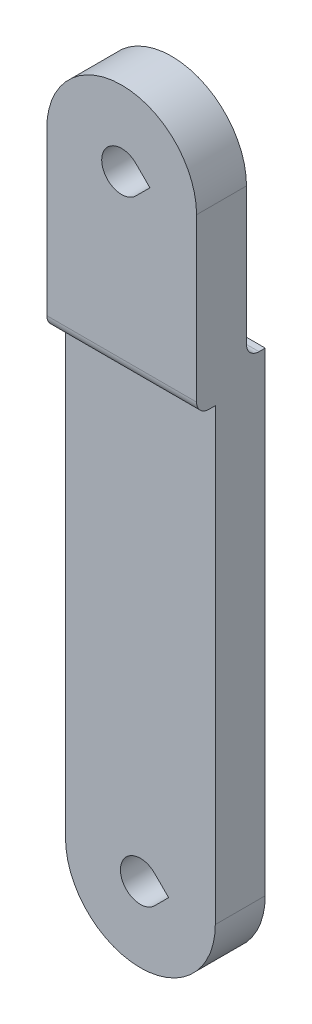
ISO-10303-21;
HEADER;
FILE_DESCRIPTION(('STEP AP214'),'2;1');
FILE_NAME('part.step','',(''),(''),'','','');
FILE_SCHEMA(('AUTOMOTIVE_DESIGN { 1 0 10303 214 1 1 1 1 }'));
ENDSEC;
DATA;
#1=APPLICATION_CONTEXT('core data for automotive mechanical design processes');
#2=APPLICATION_PROTOCOL_DEFINITION('international standard','automotive_design',2000,#1);
#3=PRODUCT_CONTEXT('',#1,'mechanical');
#4=PRODUCT('Part','Part','',(#3));
#5=PRODUCT_RELATED_PRODUCT_CATEGORY('part','',(#4));
#6=PRODUCT_DEFINITION_FORMATION('','',#4);
#7=PRODUCT_DEFINITION_CONTEXT('part definition',#1,'design');
#8=PRODUCT_DEFINITION('design','',#6,#7);
#9=PRODUCT_DEFINITION_SHAPE('','',#8);
#10=(LENGTH_UNIT() NAMED_UNIT(*) SI_UNIT(.MILLI.,.METRE.));
#11=(NAMED_UNIT(*) PLANE_ANGLE_UNIT() SI_UNIT($,.RADIAN.));
#12=(NAMED_UNIT(*) SI_UNIT($,.STERADIAN.) SOLID_ANGLE_UNIT());
#13=UNCERTAINTY_MEASURE_WITH_UNIT(LENGTH_MEASURE(1.E-05),#10,'distance_accuracy_value','');
#14=(GEOMETRIC_REPRESENTATION_CONTEXT(3) GLOBAL_UNCERTAINTY_ASSIGNED_CONTEXT((#13)) GLOBAL_UNIT_ASSIGNED_CONTEXT((#10,
#11,#12)) REPRESENTATION_CONTEXT('',''));
#15=CARTESIAN_POINT('',(0.,0.,0.));
#16=DIRECTION('',(0.,0.,1.));
#17=DIRECTION('',(1.,0.,0.));
#18=AXIS2_PLACEMENT_3D('',#15,#16,#17);
#19=CARTESIAN_POINT('',(0.,0.,11.));
#20=DIRECTION('',(0.,0.,-1.));
#21=DIRECTION('',(-1.,0.,0.));
#22=AXIS2_PLACEMENT_3D('',#19,#20,#21);
#23=CYLINDRICAL_SURFACE('',#22,6.);
#24=DIRECTION('',(0.,0.,-1.));
#25=VECTOR('',#24,1.);
#26=CARTESIAN_POINT('',(-6.,0.,11.));
#27=LINE('',#26,#25);
#28=CARTESIAN_POINT('',(-6.,0.,9.5));
#29=VERTEX_POINT('',#28);
#30=CARTESIAN_POINT('',(-6.,0.,5.5));
#31=VERTEX_POINT('',#30);
#32=EDGE_CURVE('E290',#29,#31,#27,.T.);
#33=ORIENTED_EDGE('',*,*,#32,.T.);
#34=CARTESIAN_POINT('',(0.,0.,5.5));
#35=DIRECTION('',(0.,0.,1.));
#36=DIRECTION('',(1.,0.,0.));
#37=AXIS2_PLACEMENT_3D('',#34,#35,#36);
#38=CIRCLE('',#37,6.);
#39=CARTESIAN_POINT('',(6.00000000000002,0.,5.5));
#40=VERTEX_POINT('',#39);
#41=EDGE_CURVE('E216',#31,#40,#38,.T.);
#42=ORIENTED_EDGE('',*,*,#41,.T.);
#43=DIRECTION('',(0.,0.,-1.));
#44=VECTOR('',#43,1.);
#45=CARTESIAN_POINT('',(6.00000000000002,0.,11.));
#46=LINE('',#45,#44);
#47=CARTESIAN_POINT('',(6.00000000000002,0.,9.5));
#48=VERTEX_POINT('',#47);
#49=EDGE_CURVE('E164',#48,#40,#46,.T.);
#50=ORIENTED_EDGE('',*,*,#49,.F.);
#51=CARTESIAN_POINT('',(0.,0.,9.5));
#52=DIRECTION('',(0.,0.,-1.));
#53=DIRECTION('',(0.,1.,0.));
#54=AXIS2_PLACEMENT_3D('',#51,#52,#53);
#55=CIRCLE('',#54,6.);
#56=EDGE_CURVE('E202',#48,#29,#55,.T.);
#57=ORIENTED_EDGE('',*,*,#56,.T.);
#58=EDGE_LOOP('',(#33,#42,#50,#57));
#59=FACE_BOUND('',#58,.T.);
#60=ADVANCED_FACE('F41',(#59),#23,.T.);
#61=CARTESIAN_POINT('',(0.,50.,11.));
#62=DIRECTION('',(0.,0.,1.));
#63=DIRECTION('',(1.,0.,0.));
#64=AXIS2_PLACEMENT_3D('',#61,#62,#63);
#65=PLANE('',#64);
#66=DIRECTION('',(0.,-1.,0.));
#67=VECTOR('',#66,1.);
#68=CARTESIAN_POINT('',(-5.99999999999999,50.,11.));
#69=LINE('',#68,#67);
#70=CARTESIAN_POINT('',(-5.99999999999999,50.,11.));
#71=VERTEX_POINT('',#70);
#72=CARTESIAN_POINT('',(-5.99999999999999,37.,11.));
#73=VERTEX_POINT('',#72);
#74=EDGE_CURVE('E277',#71,#73,#69,.T.);
#75=ORIENTED_EDGE('',*,*,#74,.T.);
#76=DIRECTION('',(1.,0.,0.));
#77=VECTOR('',#76,1.);
#78=CARTESIAN_POINT('',(6.00000000000001,37.,11.));
#79=LINE('',#78,#77);
#80=CARTESIAN_POINT('',(6.00000000000001,37.,11.));
#81=VERTEX_POINT('',#80);
#82=EDGE_CURVE('E313',#73,#81,#79,.T.);
#83=ORIENTED_EDGE('',*,*,#82,.T.);
#84=DIRECTION('',(0.,1.,0.));
#85=VECTOR('',#84,1.);
#86=CARTESIAN_POINT('',(6.00000000000001,50.,11.));
#87=LINE('',#86,#85);
#88=CARTESIAN_POINT('',(6.00000000000001,50.,11.));
#89=VERTEX_POINT('',#88);
#90=EDGE_CURVE('E281',#81,#89,#87,.T.);
#91=ORIENTED_EDGE('',*,*,#90,.T.);
#92=CARTESIAN_POINT('',(0.,50.,11.));
#93=DIRECTION('',(0.,0.,1.));
#94=DIRECTION('',(1.,0.,0.));
#95=AXIS2_PLACEMENT_3D('',#92,#93,#94);
#96=CIRCLE('',#95,6.);
#97=EDGE_CURVE('E273',#89,#71,#96,.T.);
#98=ORIENTED_EDGE('',*,*,#97,.T.);
#99=EDGE_LOOP('',(#75,#83,#91,#98));
#100=FACE_BOUND('',#99,.T.);
#101=DIRECTION('',(0.707106781186551,0.707106781186544,0.));
#102=VECTOR('',#101,1.);
#103=CARTESIAN_POINT('',(2.26274169979697,50.,11.));
#104=LINE('',#103,#102);
#105=CARTESIAN_POINT('',(1.13137084989848,48.8686291501015,11.));
#106=VERTEX_POINT('',#105);
#107=CARTESIAN_POINT('',(2.26274169979697,50.,11.));
#108=VERTEX_POINT('',#107);
#109=EDGE_CURVE('E255',#106,#108,#104,.T.);
#110=ORIENTED_EDGE('',*,*,#109,.F.);
#111=CARTESIAN_POINT('',(0.,50.,11.));
#112=DIRECTION('',(0.,0.,1.));
#113=DIRECTION('',(1.,0.,0.));
#114=AXIS2_PLACEMENT_3D('',#111,#112,#113);
#115=CIRCLE('',#114,1.6);
#116=CARTESIAN_POINT('',(1.13137084989848,51.1313708498985,11.));
#117=VERTEX_POINT('',#116);
#118=EDGE_CURVE('E252',#117,#106,#115,.T.);
#119=ORIENTED_EDGE('',*,*,#118,.F.);
#120=DIRECTION('',(-0.707106781186551,0.707106781186544,0.));
#121=VECTOR('',#120,1.);
#122=CARTESIAN_POINT('',(2.26274169979697,50.,11.));
#123=LINE('',#122,#121);
#124=EDGE_CURVE('E258',#108,#117,#123,.T.);
#125=ORIENTED_EDGE('',*,*,#124,.F.);
#126=EDGE_LOOP('',(#110,#119,#125));
#127=FACE_BOUND('',#126,.T.);
#128=ADVANCED_FACE('F338',(#100,#127),#65,.T.);
#129=CARTESIAN_POINT('',(0.,50.,11.));
#130=DIRECTION('',(0.,0.,-1.));
#131=DIRECTION('',(-1.,0.,0.));
#132=AXIS2_PLACEMENT_3D('',#129,#130,#131);
#133=CYLINDRICAL_SURFACE('',#132,6.);
#134=DIRECTION('',(0.,0.,-1.));
#135=VECTOR('',#134,1.);
#136=CARTESIAN_POINT('',(6.00000000000001,50.,11.));
#137=LINE('',#136,#135);
#138=CARTESIAN_POINT('',(6.00000000000001,50.,7.));
#139=VERTEX_POINT('',#138);
#140=EDGE_CURVE('E284',#89,#139,#137,.T.);
#141=ORIENTED_EDGE('',*,*,#140,.T.);
#142=CARTESIAN_POINT('',(0.,50.,7.00000000000001));
#143=DIRECTION('',(0.,0.,1.));
#144=DIRECTION('',(0.,-1.,0.));
#145=AXIS2_PLACEMENT_3D('',#142,#143,#144);
#146=CIRCLE('',#145,6.);
#147=CARTESIAN_POINT('',(-5.99999999999999,50.,7.00000000000001));
#148=VERTEX_POINT('',#147);
#149=EDGE_CURVE('E230',#139,#148,#146,.T.);
#150=ORIENTED_EDGE('',*,*,#149,.T.);
#151=DIRECTION('',(0.,0.,-1.));
#152=VECTOR('',#151,1.);
#153=CARTESIAN_POINT('',(-5.99999999999999,50.,11.));
#154=LINE('',#153,#152);
#155=EDGE_CURVE('E294',#71,#148,#154,.T.);
#156=ORIENTED_EDGE('',*,*,#155,.F.);
#157=ORIENTED_EDGE('',*,*,#97,.F.);
#158=EDGE_LOOP('',(#141,#150,#156,#157));
#159=FACE_BOUND('',#158,.T.);
#160=ADVANCED_FACE('F334',(#159),#133,.T.);
#161=CARTESIAN_POINT('',(-5.99999999999999,50.,11.));
#162=DIRECTION('',(1.,0.,0.));
#163=DIRECTION('',(0.,1.,0.));
#164=AXIS2_PLACEMENT_3D('',#161,#162,#163);
#165=PLANE('',#164);
#166=DIRECTION('',(0.,0.,-1.));
#167=VECTOR('',#166,1.);
#168=CARTESIAN_POINT('',(-5.99999999999999,38.,11.));
#169=LINE('',#168,#167);
#170=CARTESIAN_POINT('',(-5.99999999999999,38.,6.));
#171=VERTEX_POINT('',#170);
#172=CARTESIAN_POINT('',(-5.99999999999999,38.,5.5));
#173=VERTEX_POINT('',#172);
#174=EDGE_CURVE('E237',#171,#173,#169,.T.);
#175=ORIENTED_EDGE('',*,*,#174,.T.);
#176=DIRECTION('',(0.,-1.,0.));
#177=VECTOR('',#176,1.);
#178=CARTESIAN_POINT('',(-5.99999999999999,50.,5.5));
#179=LINE('',#178,#177);
#180=EDGE_CURVE('E57',#173,#31,#179,.T.);
#181=ORIENTED_EDGE('',*,*,#180,.T.);
#182=ORIENTED_EDGE('',*,*,#32,.F.);
#183=DIRECTION('',(0.,1.,0.));
#184=VECTOR('',#183,1.);
#185=CARTESIAN_POINT('',(-5.99999999999999,50.,9.5));
#186=LINE('',#185,#184);
#187=CARTESIAN_POINT('',(-5.99999999999998,36.,9.5));
#188=VERTEX_POINT('',#187);
#189=EDGE_CURVE('E206',#29,#188,#186,.T.);
#190=ORIENTED_EDGE('',*,*,#189,.T.);
#191=DIRECTION('',(0.,0.,1.));
#192=VECTOR('',#191,1.);
#193=CARTESIAN_POINT('',(-5.99999999999999,36.,11.));
#194=LINE('',#193,#192);
#195=CARTESIAN_POINT('',(-5.99999999999999,36.,10.));
#196=VERTEX_POINT('',#195);
#197=EDGE_CURVE('E233',#188,#196,#194,.T.);
#198=ORIENTED_EDGE('',*,*,#197,.T.);
#199=CARTESIAN_POINT('',(-5.99999999999999,37.,10.));
#200=DIRECTION('',(1.,0.,0.));
#201=DIRECTION('',(0.,1.,0.));
#202=AXIS2_PLACEMENT_3D('',#199,#200,#201);
#203=CIRCLE('',#202,1.);
#204=EDGE_CURVE('E310',#196,#73,#203,.F.);
#205=ORIENTED_EDGE('',*,*,#204,.T.);
#206=ORIENTED_EDGE('',*,*,#74,.F.);
#207=ORIENTED_EDGE('',*,*,#155,.T.);
#208=DIRECTION('',(0.,-1.,0.));
#209=VECTOR('',#208,1.);
#210=CARTESIAN_POINT('',(-5.99999999999999,50.,7.00000000000001));
#211=LINE('',#210,#209);
#212=CARTESIAN_POINT('',(-5.99999999999999,39.,7.));
#213=VERTEX_POINT('',#212);
#214=EDGE_CURVE('E227',#148,#213,#211,.T.);
#215=ORIENTED_EDGE('',*,*,#214,.T.);
#216=CARTESIAN_POINT('',(-5.99999999999999,39.,6.));
#217=DIRECTION('',(1.,0.,0.));
#218=DIRECTION('',(0.,1.,0.));
#219=AXIS2_PLACEMENT_3D('',#216,#217,#218);
#220=CIRCLE('',#219,1.);
#221=EDGE_CURVE('E11',#213,#171,#220,.T.);
#222=ORIENTED_EDGE('',*,*,#221,.T.);
#223=EDGE_LOOP('',(#175,#181,#182,#190,#198,#205,#206,#207,#215,#222));
#224=FACE_BOUND('',#223,.T.);
#225=ADVANCED_FACE('F330',(#224),#165,.F.);
#226=CARTESIAN_POINT('',(6.00000000000001,50.,11.));
#227=DIRECTION('',(-1.,0.,0.));
#228=DIRECTION('',(0.,-1.,0.));
#229=AXIS2_PLACEMENT_3D('',#226,#227,#228);
#230=PLANE('',#229);
#231=DIRECTION('',(0.,-1.,0.));
#232=VECTOR('',#231,1.);
#233=CARTESIAN_POINT('',(6.00000000000002,-6.,5.5));
#234=LINE('',#233,#232);
#235=CARTESIAN_POINT('',(6.00000000000001,38.,5.5));
#236=VERTEX_POINT('',#235);
#237=EDGE_CURVE('E158',#236,#40,#234,.T.);
#238=ORIENTED_EDGE('',*,*,#237,.F.);
#239=DIRECTION('',(0.,0.,-1.));
#240=VECTOR('',#239,1.);
#241=CARTESIAN_POINT('',(6.00000000000001,38.,7.));
#242=LINE('',#241,#240);
#243=CARTESIAN_POINT('',(6.00000000000001,38.,6.));
#244=VERTEX_POINT('',#243);
#245=EDGE_CURVE('E161',#244,#236,#242,.T.);
#246=ORIENTED_EDGE('',*,*,#245,.F.);
#247=CARTESIAN_POINT('',(6.00000000000001,39.,6.));
#248=DIRECTION('',(-1.,0.,0.));
#249=DIRECTION('',(0.,-1.,0.));
#250=AXIS2_PLACEMENT_3D('',#247,#248,#249);
#251=CIRCLE('',#250,1.);
#252=CARTESIAN_POINT('',(6.00000000000001,39.,7.));
#253=VERTEX_POINT('',#252);
#254=EDGE_CURVE('E50',#244,#253,#251,.T.);
#255=ORIENTED_EDGE('',*,*,#254,.T.);
#256=DIRECTION('',(0.,-1.,0.));
#257=VECTOR('',#256,1.);
#258=CARTESIAN_POINT('',(6.00000000000001,56.,7.00000000000001));
#259=LINE('',#258,#257);
#260=EDGE_CURVE('E166',#139,#253,#259,.T.);
#261=ORIENTED_EDGE('',*,*,#260,.F.);
#262=ORIENTED_EDGE('',*,*,#140,.F.);
#263=ORIENTED_EDGE('',*,*,#90,.F.);
#264=CARTESIAN_POINT('',(6.00000000000001,37.,10.));
#265=DIRECTION('',(-1.,0.,0.));
#266=DIRECTION('',(0.,-1.,0.));
#267=AXIS2_PLACEMENT_3D('',#264,#265,#266);
#268=CIRCLE('',#267,1.);
#269=CARTESIAN_POINT('',(6.00000000000001,36.,10.));
#270=VERTEX_POINT('',#269);
#271=EDGE_CURVE('E307',#81,#270,#268,.F.);
#272=ORIENTED_EDGE('',*,*,#271,.T.);
#273=DIRECTION('',(0.,0.,1.));
#274=VECTOR('',#273,1.);
#275=CARTESIAN_POINT('',(6.00000000000001,36.,9.5));
#276=LINE('',#275,#274);
#277=CARTESIAN_POINT('',(6.00000000000001,36.,9.5));
#278=VERTEX_POINT('',#277);
#279=EDGE_CURVE('E195',#278,#270,#276,.T.);
#280=ORIENTED_EDGE('',*,*,#279,.F.);
#281=DIRECTION('',(0.,1.,0.));
#282=VECTOR('',#281,1.);
#283=CARTESIAN_POINT('',(6.00000000000002,-6.,9.5));
#284=LINE('',#283,#282);
#285=EDGE_CURVE('E175',#48,#278,#284,.T.);
#286=ORIENTED_EDGE('',*,*,#285,.F.);
#287=ORIENTED_EDGE('',*,*,#49,.T.);
#288=EDGE_LOOP('',(#238,#246,#255,#261,#262,#263,#272,#280,#286,#287));
#289=FACE_BOUND('',#288,.T.);
#290=ADVANCED_FACE('F159',(#289),#230,.F.);
#291=CARTESIAN_POINT('',(0.,50.,11.));
#292=DIRECTION('',(0.,0.,-1.));
#293=DIRECTION('',(-1.,0.,0.));
#294=AXIS2_PLACEMENT_3D('',#291,#292,#293);
#295=CYLINDRICAL_SURFACE('',#294,1.6);
#296=CARTESIAN_POINT('',(0.,50.,7.00000000000001));
#297=DIRECTION('',(0.,0.,1.));
#298=DIRECTION('',(0.,-1.,0.));
#299=AXIS2_PLACEMENT_3D('',#296,#297,#298);
#300=CIRCLE('',#299,1.6);
#301=CARTESIAN_POINT('',(1.13137084989848,51.1313708498985,7.00000000000001));
#302=VERTEX_POINT('',#301);
#303=CARTESIAN_POINT('',(1.13137084989848,48.8686291501015,7.00000000000001));
#304=VERTEX_POINT('',#303);
#305=EDGE_CURVE('E224',#302,#304,#300,.T.);
#306=ORIENTED_EDGE('',*,*,#305,.F.);
#307=DIRECTION('',(0.,0.,-1.));
#308=VECTOR('',#307,1.);
#309=CARTESIAN_POINT('',(1.13137084989848,51.1313708498985,11.));
#310=LINE('',#309,#308);
#311=EDGE_CURVE('E261',#117,#302,#310,.T.);
#312=ORIENTED_EDGE('',*,*,#311,.F.);
#313=ORIENTED_EDGE('',*,*,#118,.T.);
#314=DIRECTION('',(0.,0.,-1.));
#315=VECTOR('',#314,1.);
#316=CARTESIAN_POINT('',(1.13137084989848,48.8686291501015,11.));
#317=LINE('',#316,#315);
#318=EDGE_CURVE('E269',#106,#304,#317,.T.);
#319=ORIENTED_EDGE('',*,*,#318,.T.);
#320=EDGE_LOOP('',(#306,#312,#313,#319));
#321=FACE_BOUND('',#320,.T.);
#322=ADVANCED_FACE('F385',(#321),#295,.F.);
#323=CARTESIAN_POINT('',(2.26274169979697,50.,11.));
#324=DIRECTION('',(-0.707106781186544,0.707106781186551,0.));
#325=DIRECTION('',(-0.707106781186551,-0.707106781186544,0.));
#326=AXIS2_PLACEMENT_3D('',#323,#324,#325);
#327=PLANE('',#326);
#328=DIRECTION('',(0.707106781186551,0.707106781186544,0.));
#329=VECTOR('',#328,1.);
#330=CARTESIAN_POINT('',(2.26274169979697,50.,7.00000000000001));
#331=LINE('',#330,#329);
#332=CARTESIAN_POINT('',(2.26274169979697,50.,7.00000000000001));
#333=VERTEX_POINT('',#332);
#334=EDGE_CURVE('E221',#304,#333,#331,.T.);
#335=ORIENTED_EDGE('',*,*,#334,.F.);
#336=ORIENTED_EDGE('',*,*,#318,.F.);
#337=ORIENTED_EDGE('',*,*,#109,.T.);
#338=DIRECTION('',(0.,0.,-1.));
#339=VECTOR('',#338,1.);
#340=CARTESIAN_POINT('',(2.26274169979697,50.,11.));
#341=LINE('',#340,#339);
#342=EDGE_CURVE('E265',#108,#333,#341,.T.);
#343=ORIENTED_EDGE('',*,*,#342,.T.);
#344=EDGE_LOOP('',(#335,#336,#337,#343));
#345=FACE_BOUND('',#344,.T.);
#346=ADVANCED_FACE('F381',(#345),#327,.T.);
#347=CARTESIAN_POINT('',(2.26274169979697,50.,11.));
#348=DIRECTION('',(-0.707106781186544,-0.707106781186551,0.));
#349=DIRECTION('',(0.707106781186551,-0.707106781186544,0.));
#350=AXIS2_PLACEMENT_3D('',#347,#348,#349);
#351=PLANE('',#350);
#352=DIRECTION('',(-0.707106781186551,0.707106781186544,0.));
#353=VECTOR('',#352,1.);
#354=CARTESIAN_POINT('',(2.26274169979696,50.,7.00000000000001));
#355=LINE('',#354,#353);
#356=EDGE_CURVE('E304',#333,#302,#355,.T.);
#357=ORIENTED_EDGE('',*,*,#356,.F.);
#358=ORIENTED_EDGE('',*,*,#342,.F.);
#359=ORIENTED_EDGE('',*,*,#124,.T.);
#360=ORIENTED_EDGE('',*,*,#311,.T.);
#361=EDGE_LOOP('',(#357,#358,#359,#360));
#362=FACE_BOUND('',#361,.T.);
#363=ADVANCED_FACE('F378',(#362),#351,.T.);
#364=CARTESIAN_POINT('',(-22.,36.,9.5));
#365=DIRECTION('',(0.,1.,0.));
#366=DIRECTION('',(-1.,0.,0.));
#367=AXIS2_PLACEMENT_3D('',#364,#365,#366);
#368=PLANE('',#367);
#369=ORIENTED_EDGE('',*,*,#279,.T.);
#370=DIRECTION('',(1.,0.,0.));
#371=VECTOR('',#370,1.);
#372=CARTESIAN_POINT('',(-5.99999999999999,36.,10.));
#373=LINE('',#372,#371);
#374=EDGE_CURVE('E317',#270,#196,#373,.F.);
#375=ORIENTED_EDGE('',*,*,#374,.T.);
#376=ORIENTED_EDGE('',*,*,#197,.F.);
#377=DIRECTION('',(1.,0.,0.));
#378=VECTOR('',#377,1.);
#379=CARTESIAN_POINT('',(-22.,36.,9.5));
#380=LINE('',#379,#378);
#381=EDGE_CURVE('E167',#188,#278,#380,.T.);
#382=ORIENTED_EDGE('',*,*,#381,.T.);
#383=EDGE_LOOP('',(#369,#375,#376,#382));
#384=FACE_BOUND('',#383,.T.);
#385=ADVANCED_FACE('F346',(#384),#368,.F.);
#386=CARTESIAN_POINT('',(-22.,-6.,9.5));
#387=DIRECTION('',(0.,0.,-1.));
#388=DIRECTION('',(0.,1.,0.));
#389=AXIS2_PLACEMENT_3D('',#386,#387,#388);
#390=PLANE('',#389);
#391=DIRECTION('',(-0.707106781186555,-0.70710678118654,0.));
#392=VECTOR('',#391,1.);
#393=CARTESIAN_POINT('',(2.26274169979698,0.,9.5));
#394=LINE('',#393,#392);
#395=CARTESIAN_POINT('',(2.26274169979698,0.,9.5));
#396=VERTEX_POINT('',#395);
#397=CARTESIAN_POINT('',(1.13137084989848,-1.13137084989848,9.5));
#398=VERTEX_POINT('',#397);
#399=EDGE_CURVE('E187',#396,#398,#394,.T.);
#400=ORIENTED_EDGE('',*,*,#399,.T.);
#401=CARTESIAN_POINT('',(0.,0.,9.5));
#402=DIRECTION('',(0.,0.,-1.));
#403=DIRECTION('',(0.,1.,0.));
#404=AXIS2_PLACEMENT_3D('',#401,#402,#403);
#405=CIRCLE('',#404,1.6);
#406=CARTESIAN_POINT('',(1.13137084989848,1.13137084989848,9.5));
#407=VERTEX_POINT('',#406);
#408=EDGE_CURVE('E298',#398,#407,#405,.T.);
#409=ORIENTED_EDGE('',*,*,#408,.T.);
#410=DIRECTION('',(0.707106781186555,-0.70710678118654,0.));
#411=VECTOR('',#410,1.);
#412=CARTESIAN_POINT('',(2.26274169979698,0.,9.5));
#413=LINE('',#412,#411);
#414=EDGE_CURVE('E182',#407,#396,#413,.T.);
#415=ORIENTED_EDGE('',*,*,#414,.T.);
#416=EDGE_LOOP('',(#400,#409,#415));
#417=FACE_BOUND('',#416,.T.);
#418=ORIENTED_EDGE('',*,*,#56,.F.);
#419=ORIENTED_EDGE('',*,*,#285,.T.);
#420=ORIENTED_EDGE('',*,*,#381,.F.);
#421=ORIENTED_EDGE('',*,*,#189,.F.);
#422=EDGE_LOOP('',(#418,#419,#420,#421));
#423=FACE_BOUND('',#422,.T.);
#424=ADVANCED_FACE('F350',(#417,#423),#390,.F.);
#425=CARTESIAN_POINT('',(-22.,-6.,5.5));
#426=DIRECTION('',(0.,0.,1.));
#427=DIRECTION('',(1.,0.,0.));
#428=AXIS2_PLACEMENT_3D('',#425,#426,#427);
#429=PLANE('',#428);
#430=DIRECTION('',(0.707106781186555,0.707106781186541,0.));
#431=VECTOR('',#430,1.);
#432=CARTESIAN_POINT('',(2.26274169979698,0.,5.5));
#433=LINE('',#432,#431);
#434=CARTESIAN_POINT('',(1.13137084989848,-1.13137084989848,5.5));
#435=VERTEX_POINT('',#434);
#436=CARTESIAN_POINT('',(2.26274169979698,0.,5.5));
#437=VERTEX_POINT('',#436);
#438=EDGE_CURVE('E213',#435,#437,#433,.T.);
#439=ORIENTED_EDGE('',*,*,#438,.T.);
#440=DIRECTION('',(-0.707106781186555,0.70710678118654,0.));
#441=VECTOR('',#440,1.);
#442=CARTESIAN_POINT('',(2.26274169979698,0.,5.5));
#443=LINE('',#442,#441);
#444=CARTESIAN_POINT('',(1.13137084989848,1.13137084989848,5.5));
#445=VERTEX_POINT('',#444);
#446=EDGE_CURVE('E210',#437,#445,#443,.T.);
#447=ORIENTED_EDGE('',*,*,#446,.T.);
#448=CARTESIAN_POINT('',(0.,0.,5.5));
#449=DIRECTION('',(0.,0.,1.));
#450=DIRECTION('',(1.,0.,0.));
#451=AXIS2_PLACEMENT_3D('',#448,#449,#450);
#452=CIRCLE('',#451,1.6);
#453=EDGE_CURVE('E301',#445,#435,#452,.T.);
#454=ORIENTED_EDGE('',*,*,#453,.T.);
#455=EDGE_LOOP('',(#439,#447,#454));
#456=FACE_BOUND('',#455,.T.);
#457=ORIENTED_EDGE('',*,*,#180,.F.);
#458=DIRECTION('',(-1.,0.,0.));
#459=VECTOR('',#458,1.);
#460=CARTESIAN_POINT('',(-22.,38.,5.5));
#461=LINE('',#460,#459);
#462=EDGE_CURVE('E169',#236,#173,#461,.T.);
#463=ORIENTED_EDGE('',*,*,#462,.F.);
#464=ORIENTED_EDGE('',*,*,#237,.T.);
#465=ORIENTED_EDGE('',*,*,#41,.F.);
#466=EDGE_LOOP('',(#457,#463,#464,#465));
#467=FACE_BOUND('',#466,.T.);
#468=ADVANCED_FACE('F170',(#456,#467),#429,.F.);
#469=CARTESIAN_POINT('',(-22.,38.,7.));
#470=DIRECTION('',(0.,-1.,0.));
#471=DIRECTION('',(1.,0.,0.));
#472=AXIS2_PLACEMENT_3D('',#469,#470,#471);
#473=PLANE('',#472);
#474=ORIENTED_EDGE('',*,*,#245,.T.);
#475=ORIENTED_EDGE('',*,*,#462,.T.);
#476=ORIENTED_EDGE('',*,*,#174,.F.);
#477=DIRECTION('',(1.,0.,0.));
#478=VECTOR('',#477,1.);
#479=CARTESIAN_POINT('',(6.00000000000001,38.,6.));
#480=LINE('',#479,#478);
#481=EDGE_CURVE('E180',#171,#244,#480,.T.);
#482=ORIENTED_EDGE('',*,*,#481,.T.);
#483=EDGE_LOOP('',(#474,#475,#476,#482));
#484=FACE_BOUND('',#483,.T.);
#485=ADVANCED_FACE('F178',(#484),#473,.F.);
#486=CARTESIAN_POINT('',(-22.,56.,7.00000000000001));
#487=DIRECTION('',(0.,0.,1.));
#488=DIRECTION('',(0.,-1.,0.));
#489=AXIS2_PLACEMENT_3D('',#486,#487,#488);
#490=PLANE('',#489);
#491=ORIENTED_EDGE('',*,*,#305,.T.);
#492=ORIENTED_EDGE('',*,*,#334,.T.);
#493=ORIENTED_EDGE('',*,*,#356,.T.);
#494=EDGE_LOOP('',(#491,#492,#493));
#495=FACE_BOUND('',#494,.T.);
#496=ORIENTED_EDGE('',*,*,#260,.T.);
#497=DIRECTION('',(1.,0.,0.));
#498=VECTOR('',#497,1.);
#499=CARTESIAN_POINT('',(-5.99999999999999,39.,7.));
#500=LINE('',#499,#498);
#501=EDGE_CURVE('E65',#253,#213,#500,.F.);
#502=ORIENTED_EDGE('',*,*,#501,.T.);
#503=ORIENTED_EDGE('',*,*,#214,.F.);
#504=ORIENTED_EDGE('',*,*,#149,.F.);
#505=EDGE_LOOP('',(#496,#502,#503,#504));
#506=FACE_BOUND('',#505,.T.);
#507=ADVANCED_FACE('F327',(#495,#506),#490,.F.);
#508=CARTESIAN_POINT('',(0.,0.,11.));
#509=DIRECTION('',(0.,0.,-1.));
#510=DIRECTION('',(-1.,0.,0.));
#511=AXIS2_PLACEMENT_3D('',#508,#509,#510);
#512=CYLINDRICAL_SURFACE('',#511,1.6);
#513=ORIENTED_EDGE('',*,*,#453,.F.);
#514=DIRECTION('',(0.,0.,-1.));
#515=VECTOR('',#514,1.);
#516=CARTESIAN_POINT('',(1.13137084989848,1.13137084989848,11.));
#517=LINE('',#516,#515);
#518=EDGE_CURVE('E244',#407,#445,#517,.T.);
#519=ORIENTED_EDGE('',*,*,#518,.F.);
#520=ORIENTED_EDGE('',*,*,#408,.F.);
#521=DIRECTION('',(0.,0.,-1.));
#522=VECTOR('',#521,1.);
#523=CARTESIAN_POINT('',(1.13137084989848,-1.13137084989848,11.));
#524=LINE('',#523,#522);
#525=EDGE_CURVE('E240',#398,#435,#524,.T.);
#526=ORIENTED_EDGE('',*,*,#525,.T.);
#527=EDGE_LOOP('',(#513,#519,#520,#526));
#528=FACE_BOUND('',#527,.T.);
#529=ADVANCED_FACE('F372',(#528),#512,.F.);
#530=CARTESIAN_POINT('',(2.26274169979698,0.,11.));
#531=DIRECTION('',(-0.70710678118654,-0.707106781186555,0.));
#532=DIRECTION('',(0.707106781186555,-0.70710678118654,0.));
#533=AXIS2_PLACEMENT_3D('',#530,#531,#532);
#534=PLANE('',#533);
#535=ORIENTED_EDGE('',*,*,#446,.F.);
#536=DIRECTION('',(0.,0.,-1.));
#537=VECTOR('',#536,1.);
#538=CARTESIAN_POINT('',(2.26274169979698,0.,11.));
#539=LINE('',#538,#537);
#540=EDGE_CURVE('E248',#396,#437,#539,.T.);
#541=ORIENTED_EDGE('',*,*,#540,.F.);
#542=ORIENTED_EDGE('',*,*,#414,.F.);
#543=ORIENTED_EDGE('',*,*,#518,.T.);
#544=EDGE_LOOP('',(#535,#541,#542,#543));
#545=FACE_BOUND('',#544,.T.);
#546=ADVANCED_FACE('F367',(#545),#534,.T.);
#547=CARTESIAN_POINT('',(2.26274169979698,0.,11.));
#548=DIRECTION('',(-0.707106781186541,0.707106781186555,0.));
#549=DIRECTION('',(-0.707106781186555,-0.707106781186541,0.));
#550=AXIS2_PLACEMENT_3D('',#547,#548,#549);
#551=PLANE('',#550);
#552=ORIENTED_EDGE('',*,*,#438,.F.);
#553=ORIENTED_EDGE('',*,*,#525,.F.);
#554=ORIENTED_EDGE('',*,*,#399,.F.);
#555=ORIENTED_EDGE('',*,*,#540,.T.);
#556=EDGE_LOOP('',(#552,#553,#554,#555));
#557=FACE_BOUND('',#556,.T.);
#558=ADVANCED_FACE('F363',(#557),#551,.T.);
#559=CARTESIAN_POINT('',(0.,37.,10.));
#560=DIRECTION('',(-1.,0.,0.));
#561=DIRECTION('',(0.,-1.,0.));
#562=AXIS2_PLACEMENT_3D('',#559,#560,#561);
#563=CYLINDRICAL_SURFACE('',#562,1.);
#564=ORIENTED_EDGE('',*,*,#204,.F.);
#565=ORIENTED_EDGE('',*,*,#374,.F.);
#566=ORIENTED_EDGE('',*,*,#271,.F.);
#567=ORIENTED_EDGE('',*,*,#82,.F.);
#568=EDGE_LOOP('',(#564,#565,#566,#567));
#569=FACE_BOUND('',#568,.T.);
#570=ADVANCED_FACE('F343',(#569),#563,.T.);
#571=CARTESIAN_POINT('',(-22.,39.,6.));
#572=DIRECTION('',(-1.,0.,0.));
#573=DIRECTION('',(0.,-1.,0.));
#574=AXIS2_PLACEMENT_3D('',#571,#572,#573);
#575=CYLINDRICAL_SURFACE('',#574,1.);
#576=ORIENTED_EDGE('',*,*,#221,.F.);
#577=ORIENTED_EDGE('',*,*,#501,.F.);
#578=ORIENTED_EDGE('',*,*,#254,.F.);
#579=ORIENTED_EDGE('',*,*,#481,.F.);
#580=EDGE_LOOP('',(#576,#577,#578,#579));
#581=FACE_BOUND('',#580,.T.);
#582=ADVANCED_FACE('F43',(#581),#575,.F.);
#583=CLOSED_SHELL('',(#60,#128,#160,#225,#290,#322,#346,#363,#385,#424,#468,#485,#507,#529,#546,
#558,#570,#582));
#584=MANIFOLD_SOLID_BREP('B2',#583);
#585=ADVANCED_BREP_SHAPE_REPRESENTATION('',(#18,#584),#14);
#586=SHAPE_DEFINITION_REPRESENTATION(#9,#585);
ENDSEC;
END-ISO-10303-21;
